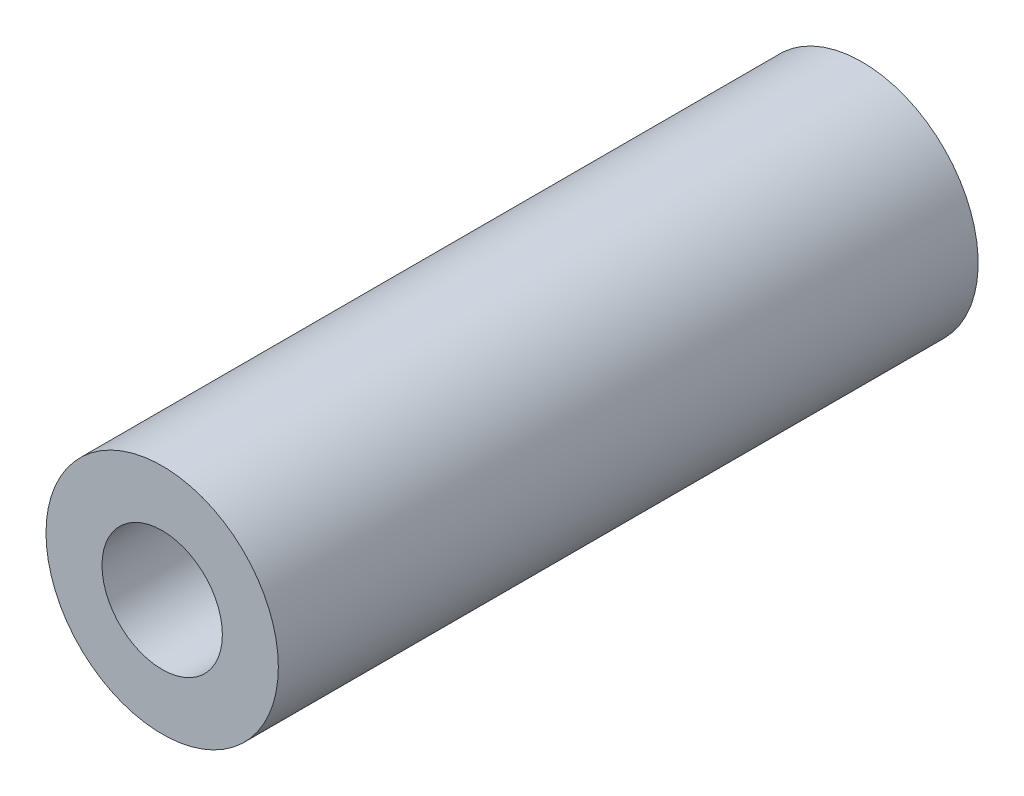
ISO-10303-21;
HEADER;
FILE_DESCRIPTION(('STEP AP214'),'2;1');
FILE_NAME('part.step','',(''),(''),'','','');
FILE_SCHEMA(('AUTOMOTIVE_DESIGN { 1 0 10303 214 1 1 1 1 }'));
ENDSEC;
DATA;
#1=APPLICATION_CONTEXT('core data for automotive mechanical design processes');
#2=APPLICATION_PROTOCOL_DEFINITION('international standard','automotive_design',2000,#1);
#3=PRODUCT_CONTEXT('',#1,'mechanical');
#4=PRODUCT('Part','Part','',(#3));
#5=PRODUCT_RELATED_PRODUCT_CATEGORY('part','',(#4));
#6=PRODUCT_DEFINITION_FORMATION('','',#4);
#7=PRODUCT_DEFINITION_CONTEXT('part definition',#1,'design');
#8=PRODUCT_DEFINITION('design','',#6,#7);
#9=PRODUCT_DEFINITION_SHAPE('','',#8);
#10=(LENGTH_UNIT() NAMED_UNIT(*) SI_UNIT(.MILLI.,.METRE.));
#11=(NAMED_UNIT(*) PLANE_ANGLE_UNIT() SI_UNIT($,.RADIAN.));
#12=(NAMED_UNIT(*) SI_UNIT($,.STERADIAN.) SOLID_ANGLE_UNIT());
#13=UNCERTAINTY_MEASURE_WITH_UNIT(LENGTH_MEASURE(1.E-05),#10,'distance_accuracy_value','');
#14=(GEOMETRIC_REPRESENTATION_CONTEXT(3) GLOBAL_UNCERTAINTY_ASSIGNED_CONTEXT((#13)) GLOBAL_UNIT_ASSIGNED_CONTEXT((#10,
#11,#12)) REPRESENTATION_CONTEXT('',''));
#15=CARTESIAN_POINT('',(0.,0.,0.));
#16=DIRECTION('',(0.,0.,1.));
#17=DIRECTION('',(1.,0.,0.));
#18=AXIS2_PLACEMENT_3D('',#15,#16,#17);
#19=CARTESIAN_POINT('',(0.,0.,228.6));
#20=DIRECTION('',(0.,0.,-1.));
#21=DIRECTION('',(-1.,0.,0.));
#22=AXIS2_PLACEMENT_3D('',#19,#20,#21);
#23=CYLINDRICAL_SURFACE('',#22,3.2766);
#24=CARTESIAN_POINT('',(0.,0.,-228.6));
#25=DIRECTION('',(0.,0.,-1.));
#26=DIRECTION('',(-1.,0.,0.));
#27=AXIS2_PLACEMENT_3D('',#24,#25,#26);
#28=CIRCLE('',#27,3.2766);
#29=CARTESIAN_POINT('',(-3.2766,0.,-228.6));
#30=VERTEX_POINT('',#29);
#31=EDGE_CURVE('E35',#30,#30,#28,.T.);
#32=ORIENTED_EDGE('',*,*,#31,.T.);
#33=EDGE_LOOP('',(#32));
#34=FACE_BOUND('',#33,.T.);
#35=CARTESIAN_POINT('',(0.,0.,-190.5));
#36=DIRECTION('',(0.,0.,1.));
#37=DIRECTION('',(1.,0.,0.));
#38=AXIS2_PLACEMENT_3D('',#35,#36,#37);
#39=CIRCLE('',#38,3.2766);
#40=CARTESIAN_POINT('',(3.2766,0.,-190.5));
#41=VERTEX_POINT('',#40);
#42=EDGE_CURVE('E42',#41,#41,#39,.F.);
#43=ORIENTED_EDGE('',*,*,#42,.F.);
#44=EDGE_LOOP('',(#43));
#45=FACE_BOUND('',#44,.T.);
#46=ADVANCED_FACE('F32',(#34,#45),#23,.F.);
#47=CARTESIAN_POINT('',(0.,0.,228.6));
#48=DIRECTION('',(0.,0.,-1.));
#49=DIRECTION('',(-1.,0.,0.));
#50=AXIS2_PLACEMENT_3D('',#47,#48,#49);
#51=CYLINDRICAL_SURFACE('',#50,6.3246);
#52=CARTESIAN_POINT('',(0.,0.,-228.6));
#53=DIRECTION('',(0.,0.,-1.));
#54=DIRECTION('',(-1.,0.,0.));
#55=AXIS2_PLACEMENT_3D('',#52,#53,#54);
#56=CIRCLE('',#55,6.3246);
#57=CARTESIAN_POINT('',(-6.3246,0.,-228.6));
#58=VERTEX_POINT('',#57);
#59=EDGE_CURVE('E10',#58,#58,#56,.F.);
#60=ORIENTED_EDGE('',*,*,#59,.T.);
#61=EDGE_LOOP('',(#60));
#62=FACE_BOUND('',#61,.T.);
#63=CARTESIAN_POINT('',(0.,0.,-190.5));
#64=DIRECTION('',(0.,0.,1.));
#65=DIRECTION('',(1.,0.,0.));
#66=AXIS2_PLACEMENT_3D('',#63,#64,#65);
#67=CIRCLE('',#66,6.3246);
#68=CARTESIAN_POINT('',(6.3246,0.,-190.5));
#69=VERTEX_POINT('',#68);
#70=EDGE_CURVE('E46',#69,#69,#67,.T.);
#71=ORIENTED_EDGE('',*,*,#70,.F.);
#72=EDGE_LOOP('',(#71));
#73=FACE_BOUND('',#72,.T.);
#74=ADVANCED_FACE('F53',(#62,#73),#51,.T.);
#75=CARTESIAN_POINT('',(0.,0.,-228.6));
#76=DIRECTION('',(0.,0.,1.));
#77=DIRECTION('',(1.,0.,0.));
#78=AXIS2_PLACEMENT_3D('',#75,#76,#77);
#79=PLANE('',#78);
#80=ORIENTED_EDGE('',*,*,#31,.F.);
#81=EDGE_LOOP('',(#80));
#82=FACE_BOUND('',#81,.T.);
#83=ORIENTED_EDGE('',*,*,#59,.F.);
#84=EDGE_LOOP('',(#83));
#85=FACE_BOUND('',#84,.T.);
#86=ADVANCED_FACE('F55',(#82,#85),#79,.F.);
#87=CARTESIAN_POINT('',(0.,0.,-190.5));
#88=DIRECTION('',(0.,0.,1.));
#89=DIRECTION('',(1.,0.,0.));
#90=AXIS2_PLACEMENT_3D('',#87,#88,#89);
#91=PLANE('',#90);
#92=ORIENTED_EDGE('',*,*,#70,.T.);
#93=EDGE_LOOP('',(#92));
#94=FACE_BOUND('',#93,.T.);
#95=ORIENTED_EDGE('',*,*,#42,.T.);
#96=EDGE_LOOP('',(#95));
#97=FACE_BOUND('',#96,.T.);
#98=ADVANCED_FACE('F50',(#94,#97),#91,.T.);
#99=CLOSED_SHELL('',(#46,#74,#86,#98));
#100=MANIFOLD_SOLID_BREP('B2',#99);
#101=ADVANCED_BREP_SHAPE_REPRESENTATION('',(#18,#100),#14);
#102=SHAPE_DEFINITION_REPRESENTATION(#9,#101);
ENDSEC;
END-ISO-10303-21;
